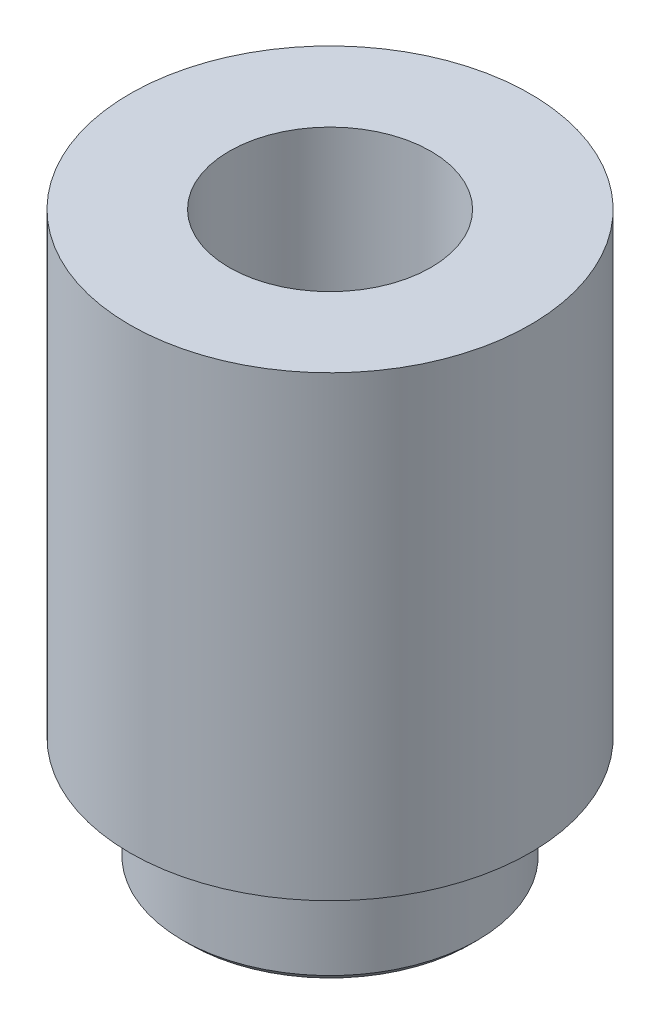
ISO-10303-21;
HEADER;
FILE_DESCRIPTION(('STEP AP214'),'2;1');
FILE_NAME('part.step','',(''),(''),'','','');
FILE_SCHEMA(('AUTOMOTIVE_DESIGN { 1 0 10303 214 1 1 1 1 }'));
ENDSEC;
DATA;
#1=APPLICATION_CONTEXT('core data for automotive mechanical design processes');
#2=APPLICATION_PROTOCOL_DEFINITION('international standard','automotive_design',2000,#1);
#3=PRODUCT_CONTEXT('',#1,'mechanical');
#4=PRODUCT('Part','Part','',(#3));
#5=PRODUCT_RELATED_PRODUCT_CATEGORY('part','',(#4));
#6=PRODUCT_DEFINITION_FORMATION('','',#4);
#7=PRODUCT_DEFINITION_CONTEXT('part definition',#1,'design');
#8=PRODUCT_DEFINITION('design','',#6,#7);
#9=PRODUCT_DEFINITION_SHAPE('','',#8);
#10=(LENGTH_UNIT() NAMED_UNIT(*) SI_UNIT(.MILLI.,.METRE.));
#11=(NAMED_UNIT(*) PLANE_ANGLE_UNIT() SI_UNIT($,.RADIAN.));
#12=(NAMED_UNIT(*) SI_UNIT($,.STERADIAN.) SOLID_ANGLE_UNIT());
#13=UNCERTAINTY_MEASURE_WITH_UNIT(LENGTH_MEASURE(1.E-05),#10,'distance_accuracy_value','');
#14=(GEOMETRIC_REPRESENTATION_CONTEXT(3) GLOBAL_UNCERTAINTY_ASSIGNED_CONTEXT((#13)) GLOBAL_UNIT_ASSIGNED_CONTEXT((#10,
#11,#12)) REPRESENTATION_CONTEXT('',''));
#15=CARTESIAN_POINT('',(0.,0.,0.));
#16=DIRECTION('',(0.,0.,1.));
#17=DIRECTION('',(1.,0.,0.));
#18=AXIS2_PLACEMENT_3D('',#15,#16,#17);
#19=CARTESIAN_POINT('',(0.,0.,0.));
#20=DIRECTION('',(0.,1.,0.));
#21=DIRECTION('',(0.,0.,1.));
#22=AXIS2_PLACEMENT_3D('',#19,#20,#21);
#23=PLANE('',#22);
#24=CARTESIAN_POINT('',(0.,0.,0.));
#25=DIRECTION('',(0.,1.,0.));
#26=DIRECTION('',(0.,0.,1.));
#27=AXIS2_PLACEMENT_3D('',#24,#25,#26);
#28=CIRCLE('',#27,2.78);
#29=CARTESIAN_POINT('',(0.,0.,2.78));
#30=VERTEX_POINT('',#29);
#31=EDGE_CURVE('E49',#30,#30,#28,.T.);
#32=ORIENTED_EDGE('',*,*,#31,.F.);
#33=EDGE_LOOP('',(#32));
#34=FACE_BOUND('',#33,.T.);
#35=CARTESIAN_POINT('',(0.,0.,0.));
#36=DIRECTION('',(0.,1.,0.));
#37=DIRECTION('',(0.,0.,1.));
#38=AXIS2_PLACEMENT_3D('',#35,#36,#37);
#39=CIRCLE('',#38,2.045);
#40=CARTESIAN_POINT('',(0.,0.,2.045));
#41=VERTEX_POINT('',#40);
#42=EDGE_CURVE('E42',#41,#41,#39,.F.);
#43=ORIENTED_EDGE('',*,*,#42,.F.);
#44=EDGE_LOOP('',(#43));
#45=FACE_BOUND('',#44,.T.);
#46=ADVANCED_FACE('F31',(#34,#45),#23,.F.);
#47=CARTESIAN_POINT('',(0.,6.35,0.));
#48=DIRECTION('',(0.,1.,0.));
#49=DIRECTION('',(0.,0.,1.));
#50=AXIS2_PLACEMENT_3D('',#47,#48,#49);
#51=PLANE('',#50);
#52=CARTESIAN_POINT('',(0.,6.35,0.));
#53=DIRECTION('',(0.,1.,0.));
#54=DIRECTION('',(0.,0.,1.));
#55=AXIS2_PLACEMENT_3D('',#52,#53,#54);
#56=CIRCLE('',#55,2.78);
#57=CARTESIAN_POINT('',(0.,6.35,2.78));
#58=VERTEX_POINT('',#57);
#59=EDGE_CURVE('E46',#58,#58,#56,.T.);
#60=ORIENTED_EDGE('',*,*,#59,.T.);
#61=EDGE_LOOP('',(#60));
#62=FACE_BOUND('',#61,.T.);
#63=CARTESIAN_POINT('',(0.,6.35,0.));
#64=DIRECTION('',(0.,1.,0.));
#65=DIRECTION('',(0.,0.,1.));
#66=AXIS2_PLACEMENT_3D('',#63,#64,#65);
#67=CIRCLE('',#66,1.4);
#68=CARTESIAN_POINT('',(0.,6.35,1.4));
#69=VERTEX_POINT('',#68);
#70=EDGE_CURVE('E52',#69,#69,#67,.T.);
#71=ORIENTED_EDGE('',*,*,#70,.F.);
#72=EDGE_LOOP('',(#71));
#73=FACE_BOUND('',#72,.T.);
#74=ADVANCED_FACE('F76',(#62,#73),#51,.T.);
#75=CARTESIAN_POINT('',(0.,6.35,0.));
#76=DIRECTION('',(0.,-1.,0.));
#77=DIRECTION('',(0.,0.,-1.));
#78=AXIS2_PLACEMENT_3D('',#75,#76,#77);
#79=CYLINDRICAL_SURFACE('',#78,2.78);
#80=ORIENTED_EDGE('',*,*,#59,.F.);
#81=EDGE_LOOP('',(#80));
#82=FACE_BOUND('',#81,.T.);
#83=ORIENTED_EDGE('',*,*,#31,.T.);
#84=EDGE_LOOP('',(#83));
#85=FACE_BOUND('',#84,.T.);
#86=ADVANCED_FACE('F72',(#82,#85),#79,.T.);
#87=CARTESIAN_POINT('',(0.,6.35,0.));
#88=DIRECTION('',(0.,-1.,0.));
#89=DIRECTION('',(0.,0.,-1.));
#90=AXIS2_PLACEMENT_3D('',#87,#88,#89);
#91=CYLINDRICAL_SURFACE('',#90,1.4);
#92=ORIENTED_EDGE('',*,*,#70,.T.);
#93=EDGE_LOOP('',(#92));
#94=FACE_BOUND('',#93,.T.);
#95=CARTESIAN_POINT('',(0.,-1.52,0.));
#96=DIRECTION('',(0.,-1.,0.));
#97=DIRECTION('',(0.,0.,-1.));
#98=AXIS2_PLACEMENT_3D('',#95,#96,#97);
#99=CIRCLE('',#98,1.4);
#100=CARTESIAN_POINT('',(0.,-1.52,-1.4));
#101=VERTEX_POINT('',#100);
#102=EDGE_CURVE('E57',#101,#101,#99,.T.);
#103=ORIENTED_EDGE('',*,*,#102,.T.);
#104=EDGE_LOOP('',(#103));
#105=FACE_BOUND('',#104,.T.);
#106=ADVANCED_FACE('F61',(#94,#105),#91,.F.);
#107=CARTESIAN_POINT('',(0.,-1.52,0.));
#108=DIRECTION('',(0.,-1.,0.));
#109=DIRECTION('',(0.,0.,-1.));
#110=AXIS2_PLACEMENT_3D('',#107,#108,#109);
#111=PLANE('',#110);
#112=CARTESIAN_POINT('',(0.,-1.52,0.));
#113=DIRECTION('',(0.,-1.,0.));
#114=DIRECTION('',(0.,0.,-1.));
#115=AXIS2_PLACEMENT_3D('',#112,#113,#114);
#116=CIRCLE('',#115,1.945);
#117=CARTESIAN_POINT('',(0.,-1.52,-1.945));
#118=VERTEX_POINT('',#117);
#119=EDGE_CURVE('E38',#118,#118,#116,.T.);
#120=ORIENTED_EDGE('',*,*,#119,.T.);
#121=EDGE_LOOP('',(#120));
#122=FACE_BOUND('',#121,.T.);
#123=ORIENTED_EDGE('',*,*,#102,.F.);
#124=EDGE_LOOP('',(#123));
#125=FACE_BOUND('',#124,.T.);
#126=ADVANCED_FACE('F63',(#122,#125),#111,.T.);
#127=CARTESIAN_POINT('',(0.,-1.52,0.));
#128=DIRECTION('',(0.,1.,0.));
#129=DIRECTION('',(0.,0.,1.));
#130=AXIS2_PLACEMENT_3D('',#127,#128,#129);
#131=CYLINDRICAL_SURFACE('',#130,2.045);
#132=CARTESIAN_POINT('',(0.,-1.42,0.));
#133=DIRECTION('',(0.,-1.,0.));
#134=DIRECTION('',(0.,0.,-1.));
#135=AXIS2_PLACEMENT_3D('',#132,#133,#134);
#136=CIRCLE('',#135,2.045);
#137=CARTESIAN_POINT('',(0.,-1.42,-2.045));
#138=VERTEX_POINT('',#137);
#139=EDGE_CURVE('E10',#138,#138,#136,.F.);
#140=ORIENTED_EDGE('',*,*,#139,.T.);
#141=EDGE_LOOP('',(#140));
#142=FACE_BOUND('',#141,.T.);
#143=ORIENTED_EDGE('',*,*,#42,.T.);
#144=EDGE_LOOP('',(#143));
#145=FACE_BOUND('',#144,.T.);
#146=ADVANCED_FACE('F65',(#142,#145),#131,.T.);
#147=CARTESIAN_POINT('',(0.,-1.52,0.));
#148=DIRECTION('',(0.,1.,0.));
#149=DIRECTION('',(0.,0.,1.));
#150=AXIS2_PLACEMENT_3D('',#147,#148,#149);
#151=CONICAL_SURFACE('',#150,1.945,0.785398163397446);
#152=ORIENTED_EDGE('',*,*,#139,.F.);
#153=EDGE_LOOP('',(#152));
#154=FACE_BOUND('',#153,.T.);
#155=ORIENTED_EDGE('',*,*,#119,.F.);
#156=EDGE_LOOP('',(#155));
#157=FACE_BOUND('',#156,.T.);
#158=ADVANCED_FACE('F33',(#154,#157),#151,.T.);
#159=CLOSED_SHELL('',(#46,#74,#86,#106,#126,#146,#158));
#160=MANIFOLD_SOLID_BREP('B2',#159);
#161=ADVANCED_BREP_SHAPE_REPRESENTATION('',(#18,#160),#14);
#162=SHAPE_DEFINITION_REPRESENTATION(#9,#161);
ENDSEC;
END-ISO-10303-21;
